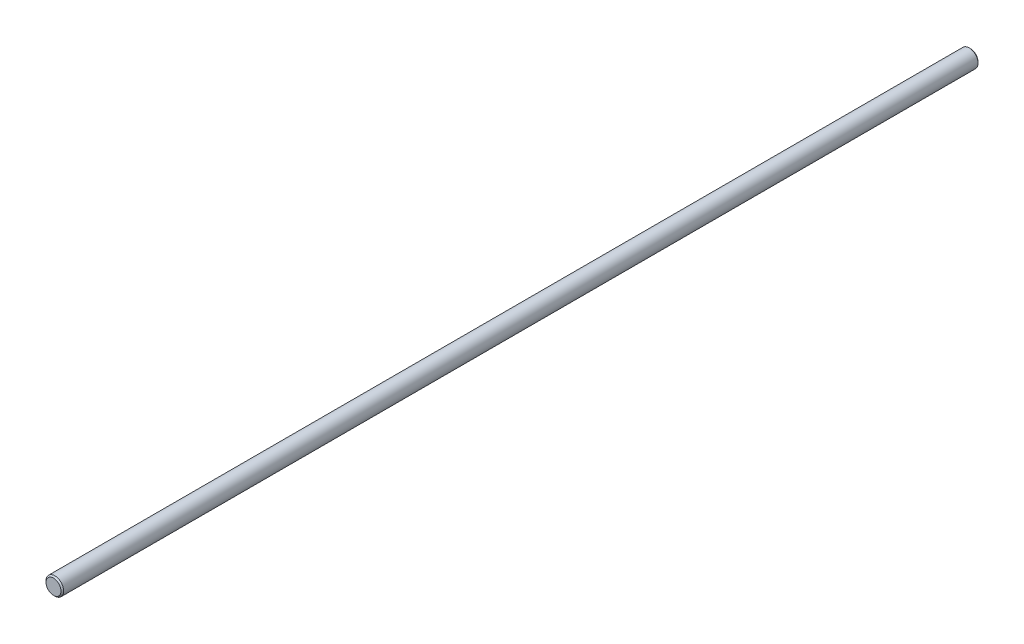
ISO-10303-21;
HEADER;
FILE_DESCRIPTION(('STEP AP214'),'2;1');
FILE_NAME('part.step','',(''),(''),'','','');
FILE_SCHEMA(('AUTOMOTIVE_DESIGN { 1 0 10303 214 1 1 1 1 }'));
ENDSEC;
DATA;
#1=APPLICATION_CONTEXT('core data for automotive mechanical design processes');
#2=APPLICATION_PROTOCOL_DEFINITION('international standard','automotive_design',2000,#1);
#3=PRODUCT_CONTEXT('',#1,'mechanical');
#4=PRODUCT('Part','Part','',(#3));
#5=PRODUCT_RELATED_PRODUCT_CATEGORY('part','',(#4));
#6=PRODUCT_DEFINITION_FORMATION('','',#4);
#7=PRODUCT_DEFINITION_CONTEXT('part definition',#1,'design');
#8=PRODUCT_DEFINITION('design','',#6,#7);
#9=PRODUCT_DEFINITION_SHAPE('','',#8);
#10=(LENGTH_UNIT() NAMED_UNIT(*) SI_UNIT(.MILLI.,.METRE.));
#11=(NAMED_UNIT(*) PLANE_ANGLE_UNIT() SI_UNIT($,.RADIAN.));
#12=(NAMED_UNIT(*) SI_UNIT($,.STERADIAN.) SOLID_ANGLE_UNIT());
#13=UNCERTAINTY_MEASURE_WITH_UNIT(LENGTH_MEASURE(1.E-05),#10,'distance_accuracy_value','');
#14=(GEOMETRIC_REPRESENTATION_CONTEXT(3) GLOBAL_UNCERTAINTY_ASSIGNED_CONTEXT((#13)) GLOBAL_UNIT_ASSIGNED_CONTEXT((#10,
#11,#12)) REPRESENTATION_CONTEXT('',''));
#15=CARTESIAN_POINT('',(0.,0.,0.));
#16=DIRECTION('',(0.,0.,1.));
#17=DIRECTION('',(1.,0.,0.));
#18=AXIS2_PLACEMENT_3D('',#15,#16,#17);
#19=CARTESIAN_POINT('',(0.,0.,206.3115));
#20=DIRECTION('',(0.,0.,-1.));
#21=DIRECTION('',(-1.,0.,0.));
#22=AXIS2_PLACEMENT_3D('',#19,#20,#21);
#23=CYLINDRICAL_SURFACE('',#22,3.96874999999984);
#24=CARTESIAN_POINT('',(0.,0.,-205.7161875));
#25=DIRECTION('',(0.,0.,1.));
#26=DIRECTION('',(1.,0.,0.));
#27=AXIS2_PLACEMENT_3D('',#24,#25,#26);
#28=CIRCLE('',#27,3.96874999999984);
#29=CARTESIAN_POINT('',(-3.96874999999984,0.,-205.7161875));
#30=VERTEX_POINT('',#29);
#31=EDGE_CURVE('E51',#30,#30,#28,.T.);
#32=CARTESIAN_POINT('',(0.,0.,205.7161875));
#33=DIRECTION('',(0.,0.,1.));
#34=DIRECTION('',(1.,0.,0.));
#35=AXIS2_PLACEMENT_3D('',#32,#33,#34);
#36=CIRCLE('',#35,3.96874999999984);
#37=CARTESIAN_POINT('',(-3.96874999999984,0.,205.7161875));
#38=VERTEX_POINT('',#37);
#39=EDGE_CURVE('E55',#38,#38,#36,.F.);
#40=CARTESIAN_POINT('',(-3.96874999999984,0.,-205.7161875));
#41=CARTESIAN_POINT('',(-3.96874999999984,0.,-201.43043359375));
#42=CARTESIAN_POINT('',(-3.96874999999984,0.,-197.1446796875));
#43=CARTESIAN_POINT('',(-3.96874999999984,0.,-188.573171875));
#44=CARTESIAN_POINT('',(-3.96874999999984,0.,-184.28741796875));
#45=CARTESIAN_POINT('',(-3.96874999999984,0.,-175.71591015625));
#46=CARTESIAN_POINT('',(-3.96874999999984,0.,-171.43015625));
#47=CARTESIAN_POINT('',(-3.96874999999984,0.,-162.8586484375));
#48=CARTESIAN_POINT('',(-3.96874999999984,0.,-158.57289453125));
#49=CARTESIAN_POINT('',(-3.96874999999984,0.,-150.00138671875));
#50=CARTESIAN_POINT('',(-3.96874999999984,0.,-145.7156328125));
#51=CARTESIAN_POINT('',(-3.96874999999984,0.,-137.144125));
#52=CARTESIAN_POINT('',(-3.96874999999984,0.,-132.85837109375));
#53=CARTESIAN_POINT('',(-3.96874999999984,0.,-124.28686328125));
#54=CARTESIAN_POINT('',(-3.96874999999984,0.,-120.001109375));
#55=CARTESIAN_POINT('',(-3.96874999999984,0.,-111.4296015625));
#56=CARTESIAN_POINT('',(-3.96874999999984,0.,-107.14384765625));
#57=CARTESIAN_POINT('',(-3.96874999999984,0.,-98.57233984375));
#58=CARTESIAN_POINT('',(-3.96874999999984,0.,-94.2865859375));
#59=CARTESIAN_POINT('',(-3.96874999999984,0.,-85.715078125));
#60=CARTESIAN_POINT('',(-3.96874999999984,0.,-81.42932421875));
#61=CARTESIAN_POINT('',(-3.96874999999984,0.,-72.85781640625));
#62=CARTESIAN_POINT('',(-3.96874999999984,0.,-68.5720625));
#63=CARTESIAN_POINT('',(-3.96874999999984,0.,-60.0005546875));
#64=CARTESIAN_POINT('',(-3.96874999999984,0.,-55.71480078125));
#65=CARTESIAN_POINT('',(-3.96874999999984,0.,-47.14329296875));
#66=CARTESIAN_POINT('',(-3.96874999999984,0.,-42.8575390625));
#67=CARTESIAN_POINT('',(-3.96874999999984,0.,-34.28603125));
#68=CARTESIAN_POINT('',(-3.96874999999984,0.,-30.00027734375));
#69=CARTESIAN_POINT('',(-3.96874999999984,0.,-21.42876953125));
#70=CARTESIAN_POINT('',(-3.96874999999984,0.,-17.143015625));
#71=CARTESIAN_POINT('',(-3.96874999999984,0.,-8.57150781249999));
#72=CARTESIAN_POINT('',(-3.96874999999984,0.,-4.28575390624999));
#73=CARTESIAN_POINT('',(-3.96874999999984,0.,4.28575390624999));
#74=CARTESIAN_POINT('',(-3.96874999999984,0.,8.57150781249999));
#75=CARTESIAN_POINT('',(-3.96874999999984,0.,17.143015625));
#76=CARTESIAN_POINT('',(-3.96874999999984,0.,21.42876953125));
#77=CARTESIAN_POINT('',(-3.96874999999984,0.,30.00027734375));
#78=CARTESIAN_POINT('',(-3.96874999999984,0.,34.28603125));
#79=CARTESIAN_POINT('',(-3.96874999999984,0.,42.8575390625));
#80=CARTESIAN_POINT('',(-3.96874999999984,0.,47.14329296875));
#81=CARTESIAN_POINT('',(-3.96874999999984,0.,55.71480078125));
#82=CARTESIAN_POINT('',(-3.96874999999984,0.,60.0005546875));
#83=CARTESIAN_POINT('',(-3.96874999999984,0.,68.5720625));
#84=CARTESIAN_POINT('',(-3.96874999999984,0.,72.85781640625));
#85=CARTESIAN_POINT('',(-3.96874999999984,0.,81.4293242187499));
#86=CARTESIAN_POINT('',(-3.96874999999984,0.,85.7150781249999));
#87=CARTESIAN_POINT('',(-3.96874999999984,0.,94.2865859375));
#88=CARTESIAN_POINT('',(-3.96874999999984,0.,98.57233984375));
#89=CARTESIAN_POINT('',(-3.96874999999984,0.,107.14384765625));
#90=CARTESIAN_POINT('',(-3.96874999999984,0.,111.4296015625));
#91=CARTESIAN_POINT('',(-3.96874999999984,0.,120.001109375));
#92=CARTESIAN_POINT('',(-3.96874999999984,0.,124.28686328125));
#93=CARTESIAN_POINT('',(-3.96874999999984,0.,132.85837109375));
#94=CARTESIAN_POINT('',(-3.96874999999984,0.,137.144125));
#95=CARTESIAN_POINT('',(-3.96874999999984,0.,145.7156328125));
#96=CARTESIAN_POINT('',(-3.96874999999984,0.,150.00138671875));
#97=CARTESIAN_POINT('',(-3.96874999999984,0.,158.57289453125));
#98=CARTESIAN_POINT('',(-3.96874999999984,0.,162.8586484375));
#99=CARTESIAN_POINT('',(-3.96874999999984,0.,171.43015625));
#100=CARTESIAN_POINT('',(-3.96874999999984,0.,175.71591015625));
#101=CARTESIAN_POINT('',(-3.96874999999984,0.,184.28741796875));
#102=CARTESIAN_POINT('',(-3.96874999999984,0.,188.573171875));
#103=CARTESIAN_POINT('',(-3.96874999999984,0.,197.1446796875));
#104=CARTESIAN_POINT('',(-3.96874999999984,0.,201.43043359375));
#105=CARTESIAN_POINT('',(-3.96874999999984,0.,205.7161875));
#106=B_SPLINE_CURVE_WITH_KNOTS('',3,(#40,#41,#42,#43,#44,#45,#46,#47,#48,#49,#50,#51,#52,#53,
#54,#55,#56,#57,#58,#59,#60,#61,#62,#63,#64,#65,#66,#67,#68,#69,#70,#71,#72,#73,#74,#75,#76,#77,
#78,#79,#80,#81,#82,#83,#84,#85,#86,#87,#88,#89,#90,#91,#92,#93,#94,#95,#96,#97,#98,#99,#100,
#101,#102,#103,#104,#105),.UNSPECIFIED.,.F.,.F.,(4,2,2,2,2,2,2,2,2,2,2,2,2,2,2,2,2,2,2,2,2,2,2,
2,2,2,2,2,2,2,2,2,4),(0.,12.85726171875,25.7145234375,38.57178515625,51.429046875,
64.28630859375,77.1435703125,90.00083203125,102.85809375,115.71535546875,128.5726171875,
141.42987890625,154.287140625,167.14440234375,180.0016640625,192.85892578125,205.7161875,
218.57344921875,231.4307109375,244.28797265625,257.145234375,270.00249609375,282.8597578125,
295.71701953125,308.57428125,321.43154296875,334.2888046875,347.14606640625,360.003328125,
372.86058984375,385.7178515625,398.57511328125,411.432375),.UNSPECIFIED.);
#107=EDGE_CURVE('BSEAM40',#30,#38,#106,.T.);
#108=ORIENTED_EDGE('',*,*,#31,.T.);
#109=ORIENTED_EDGE('',*,*,#39,.T.);
#110=ORIENTED_EDGE('',*,*,#107,.T.);
#111=ORIENTED_EDGE('',*,*,#107,.F.);
#112=EDGE_LOOP('',(#108,#110,#109,#111));
#113=FACE_BOUND('',#112,.T.);
#114=ADVANCED_FACE('F40',(#113),#23,.T.);
#115=CARTESIAN_POINT('',(0.,0.,206.3115));
#116=DIRECTION('',(0.,0.,1.));
#117=DIRECTION('',(1.,0.,0.));
#118=AXIS2_PLACEMENT_3D('',#115,#116,#117);
#119=PLANE('',#118);
#120=CARTESIAN_POINT('',(0.,0.,206.3115));
#121=DIRECTION('',(0.,0.,1.));
#122=DIRECTION('',(1.,0.,0.));
#123=AXIS2_PLACEMENT_3D('',#120,#121,#122);
#124=CIRCLE('',#123,3.3734374999998);
#125=CARTESIAN_POINT('',(-3.37343749999981,0.,206.3115));
#126=VERTEX_POINT('',#125);
#127=EDGE_CURVE('E10',#126,#126,#124,.T.);
#128=ORIENTED_EDGE('',*,*,#127,.T.);
#129=EDGE_LOOP('',(#128));
#130=FACE_BOUND('',#129,.T.);
#131=ADVANCED_FACE('F71',(#130),#119,.T.);
#132=CARTESIAN_POINT('',(0.,0.,-206.3115));
#133=DIRECTION('',(0.,0.,1.));
#134=DIRECTION('',(1.,0.,0.));
#135=AXIS2_PLACEMENT_3D('',#132,#133,#134);
#136=PLANE('',#135);
#137=CARTESIAN_POINT('',(0.,0.,-206.3115));
#138=DIRECTION('',(0.,0.,1.));
#139=DIRECTION('',(1.,0.,0.));
#140=AXIS2_PLACEMENT_3D('',#137,#138,#139);
#141=CIRCLE('',#140,3.3734374999998);
#142=CARTESIAN_POINT('',(3.3734374999998,0.,-206.3115));
#143=VERTEX_POINT('',#142);
#144=EDGE_CURVE('E47',#143,#143,#141,.F.);
#145=ORIENTED_EDGE('',*,*,#144,.T.);
#146=EDGE_LOOP('',(#145));
#147=FACE_BOUND('',#146,.T.);
#148=ADVANCED_FACE('F68',(#147),#136,.F.);
#149=CARTESIAN_POINT('',(0.,0.,-205.7161875));
#150=DIRECTION('',(0.,0.,1.));
#151=DIRECTION('',(1.,0.,0.));
#152=AXIS2_PLACEMENT_3D('',#149,#150,#151);
#153=CONICAL_SURFACE('',#152,3.96874999999984,0.785398163397434);
#154=ORIENTED_EDGE('',*,*,#144,.F.);
#155=EDGE_LOOP('',(#154));
#156=FACE_BOUND('',#155,.T.);
#157=ORIENTED_EDGE('',*,*,#31,.F.);
#158=EDGE_LOOP('',(#157));
#159=FACE_BOUND('',#158,.T.);
#160=ADVANCED_FACE('F64',(#156,#159),#153,.T.);
#161=CARTESIAN_POINT('',(0.,0.,206.3115));
#162=DIRECTION('',(0.,0.,-1.));
#163=DIRECTION('',(-1.,0.,0.));
#164=AXIS2_PLACEMENT_3D('',#161,#162,#163);
#165=CONICAL_SURFACE('',#164,3.3734374999998,0.785398163397434);
#166=CARTESIAN_POINT('',(-3.96874999999985,0.,205.7161875));
#167=CARTESIAN_POINT('',(-3.96254882812485,0.,205.722388671875));
#168=CARTESIAN_POINT('',(-3.95634765624985,0.,205.72858984375));
#169=CARTESIAN_POINT('',(-3.94394531249985,0.,205.7409921875));
#170=CARTESIAN_POINT('',(-3.93774414062485,0.,205.747193359375));
#171=CARTESIAN_POINT('',(-3.92534179687485,0.,205.759595703125));
#172=CARTESIAN_POINT('',(-3.91914062499985,0.,205.765796875));
#173=CARTESIAN_POINT('',(-3.90673828124985,0.,205.77819921875));
#174=CARTESIAN_POINT('',(-3.90053710937485,0.,205.784400390625));
#175=CARTESIAN_POINT('',(-3.88813476562485,0.,205.796802734375));
#176=CARTESIAN_POINT('',(-3.88193359374985,0.,205.80300390625));
#177=CARTESIAN_POINT('',(-3.86953124999984,0.,205.81540625));
#178=CARTESIAN_POINT('',(-3.86333007812484,0.,205.821607421875));
#179=CARTESIAN_POINT('',(-3.85092773437484,0.,205.834009765625));
#180=CARTESIAN_POINT('',(-3.84472656249984,0.,205.8402109375));
#181=CARTESIAN_POINT('',(-3.83232421874985,0.,205.85261328125));
#182=CARTESIAN_POINT('',(-3.82612304687484,0.,205.858814453125));
#183=CARTESIAN_POINT('',(-3.81372070312484,0.,205.871216796875));
#184=CARTESIAN_POINT('',(-3.80751953124984,0.,205.87741796875));
#185=CARTESIAN_POINT('',(-3.79511718749984,0.,205.8898203125));
#186=CARTESIAN_POINT('',(-3.78891601562484,0.,205.896021484375));
#187=CARTESIAN_POINT('',(-3.77651367187484,0.,205.908423828125));
#188=CARTESIAN_POINT('',(-3.77031249999984,0.,205.914625));
#189=CARTESIAN_POINT('',(-3.75791015624984,0.,205.92702734375));
#190=CARTESIAN_POINT('',(-3.75170898437483,0.,205.933228515625));
#191=CARTESIAN_POINT('',(-3.73930664062483,0.,205.945630859375));
#192=CARTESIAN_POINT('',(-3.73310546874984,0.,205.95183203125));
#193=CARTESIAN_POINT('',(-3.72070312499984,0.,205.964234375));
#194=CARTESIAN_POINT('',(-3.71450195312484,0.,205.970435546875));
#195=CARTESIAN_POINT('',(-3.70209960937483,0.,205.982837890625));
#196=CARTESIAN_POINT('',(-3.69589843749983,0.,205.9890390625));
#197=CARTESIAN_POINT('',(-3.68349609374983,0.,206.00144140625));
#198=CARTESIAN_POINT('',(-3.67729492187483,0.,206.007642578125));
#199=CARTESIAN_POINT('',(-3.66489257812483,0.,206.020044921875));
#200=CARTESIAN_POINT('',(-3.65869140624983,0.,206.02624609375));
#201=CARTESIAN_POINT('',(-3.64628906249983,0.,206.0386484375));
#202=CARTESIAN_POINT('',(-3.64008789062483,0.,206.044849609375));
#203=CARTESIAN_POINT('',(-3.62768554687483,0.,206.057251953125));
#204=CARTESIAN_POINT('',(-3.62148437499983,0.,206.063453125));
#205=CARTESIAN_POINT('',(-3.60908203124983,0.,206.07585546875));
#206=CARTESIAN_POINT('',(-3.60288085937483,0.,206.082056640625));
#207=CARTESIAN_POINT('',(-3.59047851562483,0.,206.094458984375));
#208=CARTESIAN_POINT('',(-3.58427734374983,0.,206.10066015625));
#209=CARTESIAN_POINT('',(-3.57187499999982,0.,206.1130625));
#210=CARTESIAN_POINT('',(-3.56567382812482,0.,206.119263671875));
#211=CARTESIAN_POINT('',(-3.55327148437482,0.,206.131666015625));
#212=CARTESIAN_POINT('',(-3.54707031249983,0.,206.1378671875));
#213=CARTESIAN_POINT('',(-3.53466796874983,0.,206.15026953125));
#214=CARTESIAN_POINT('',(-3.52846679687482,0.,206.156470703125));
#215=CARTESIAN_POINT('',(-3.51606445312482,0.,206.168873046875));
#216=CARTESIAN_POINT('',(-3.50986328124982,0.,206.17507421875));
#217=CARTESIAN_POINT('',(-3.49746093749982,0.,206.1874765625));
#218=CARTESIAN_POINT('',(-3.49125976562482,0.,206.193677734375));
#219=CARTESIAN_POINT('',(-3.47885742187482,0.,206.206080078125));
#220=CARTESIAN_POINT('',(-3.47265624999982,0.,206.21228125));
#221=CARTESIAN_POINT('',(-3.46025390624982,0.,206.22468359375));
#222=CARTESIAN_POINT('',(-3.45405273437481,0.,206.230884765625));
#223=CARTESIAN_POINT('',(-3.44165039062482,0.,206.243287109375));
#224=CARTESIAN_POINT('',(-3.43544921874982,0.,206.24948828125));
#225=CARTESIAN_POINT('',(-3.42304687499982,0.,206.261890625));
#226=CARTESIAN_POINT('',(-3.41684570312482,0.,206.268091796875));
#227=CARTESIAN_POINT('',(-3.40444335937481,0.,206.280494140625));
#228=CARTESIAN_POINT('',(-3.39824218749981,0.,206.2866953125));
#229=CARTESIAN_POINT('',(-3.38583984374981,0.,206.29909765625));
#230=CARTESIAN_POINT('',(-3.37963867187481,0.,206.305298828125));
#231=CARTESIAN_POINT('',(-3.37343749999981,0.,206.3115));
#232=B_SPLINE_CURVE_WITH_KNOTS('',3,(#166,#167,#168,#169,#170,#171,#172,#173,#174,#175,#176,
#177,#178,#179,#180,#181,#182,#183,#184,#185,#186,#187,#188,#189,#190,#191,#192,#193,#194,#195,
#196,#197,#198,#199,#200,#201,#202,#203,#204,#205,#206,#207,#208,#209,#210,#211,#212,#213,#214,
#215,#216,#217,#218,#219,#220,#221,#222,#223,#224,#225,#226,#227,#228,#229,#230,#231),
.UNSPECIFIED.,.F.,.F.,(4,2,2,2,2,2,2,2,2,2,2,2,2,2,2,2,2,2,2,2,2,2,2,2,2,2,2,2,2,2,2,2,4),(0.,
0.0263093441046905,0.0526186882093816,0.0789280323140721,0.105237376418783,0.131546720523473,
0.157856064628164,0.184165408732874,0.210474752837565,0.236784096942256,0.263093441046966,
0.289402785151657,0.315712129256348,0.342021473361058,0.368330817465749,0.39464016157044,
0.42094950567515,0.447258849779841,0.473568193884532,0.499877537989222,0.526186882093933,
0.552496226198623,0.578805570303314,0.605114914408024,0.631424258512715,0.657733602617406,
0.684042946722116,0.710352290826807,0.736661634931497,0.762970979036208,0.789280323140898,
0.815589667245589,0.8418990113503),.UNSPECIFIED.);
#233=EDGE_CURVE('BSEAM42',#38,#126,#232,.T.);
#234=ORIENTED_EDGE('',*,*,#39,.F.);
#235=ORIENTED_EDGE('',*,*,#127,.F.);
#236=ORIENTED_EDGE('',*,*,#233,.T.);
#237=ORIENTED_EDGE('',*,*,#233,.F.);
#238=EDGE_LOOP('',(#234,#236,#235,#237));
#239=FACE_BOUND('',#238,.T.);
#240=ADVANCED_FACE('F42',(#239),#165,.T.);
#241=CLOSED_SHELL('',(#114,#131,#148,#160,#240));
#242=MANIFOLD_SOLID_BREP('B2',#241);
#243=ADVANCED_BREP_SHAPE_REPRESENTATION('',(#18,#242),#14);
#244=SHAPE_DEFINITION_REPRESENTATION(#9,#243);
ENDSEC;
END-ISO-10303-21;
